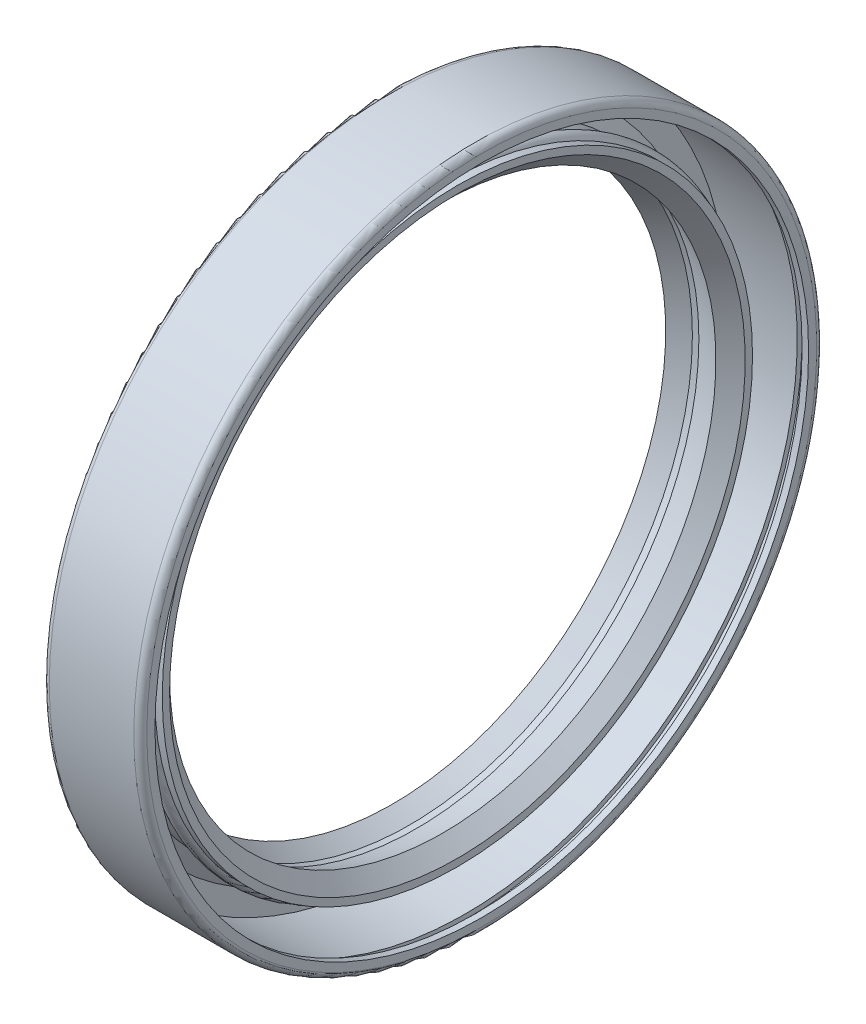
ISO-10303-21;
HEADER;
FILE_DESCRIPTION(('STEP AP214'),'2;1');
FILE_NAME('part.step','',(''),(''),'','','');
FILE_SCHEMA(('AUTOMOTIVE_DESIGN { 1 0 10303 214 1 1 1 1 }'));
ENDSEC;
DATA;
#1=APPLICATION_CONTEXT('core data for automotive mechanical design processes');
#2=APPLICATION_PROTOCOL_DEFINITION('international standard','automotive_design',2000,#1);
#3=PRODUCT_CONTEXT('',#1,'mechanical');
#4=PRODUCT('Part','Part','',(#3));
#5=PRODUCT_RELATED_PRODUCT_CATEGORY('part','',(#4));
#6=PRODUCT_DEFINITION_FORMATION('','',#4);
#7=PRODUCT_DEFINITION_CONTEXT('part definition',#1,'design');
#8=PRODUCT_DEFINITION('design','',#6,#7);
#9=PRODUCT_DEFINITION_SHAPE('','',#8);
#10=(LENGTH_UNIT() NAMED_UNIT(*) SI_UNIT(.MILLI.,.METRE.));
#11=(NAMED_UNIT(*) PLANE_ANGLE_UNIT() SI_UNIT($,.RADIAN.));
#12=(NAMED_UNIT(*) SI_UNIT($,.STERADIAN.) SOLID_ANGLE_UNIT());
#13=UNCERTAINTY_MEASURE_WITH_UNIT(LENGTH_MEASURE(1.E-05),#10,'distance_accuracy_value','');
#14=(GEOMETRIC_REPRESENTATION_CONTEXT(3) GLOBAL_UNCERTAINTY_ASSIGNED_CONTEXT((#13)) GLOBAL_UNIT_ASSIGNED_CONTEXT((#10,
#11,#12)) REPRESENTATION_CONTEXT('',''));
#15=CARTESIAN_POINT('',(0.,0.,0.));
#16=DIRECTION('',(0.,0.,1.));
#17=DIRECTION('',(1.,0.,0.));
#18=AXIS2_PLACEMENT_3D('',#15,#16,#17);
#19=CARTESIAN_POINT('',(0.,0.,0.));
#20=DIRECTION('',(-1.,0.,0.));
#21=DIRECTION('',(0.,0.,1.));
#22=AXIS2_PLACEMENT_3D('',#19,#20,#21);
#23=CONICAL_SURFACE('',#22,15.6830127018922,1.04719755119659);
#24=CARTESIAN_POINT('',(0.250000000000002,0.,0.));
#25=DIRECTION('',(-1.,0.,0.));
#26=DIRECTION('',(0.,0.,1.));
#27=AXIS2_PLACEMENT_3D('',#24,#25,#26);
#28=CIRCLE('',#27,15.25);
#29=CARTESIAN_POINT('',(0.250000000000002,0.,15.25));
#30=VERTEX_POINT('',#29);
#31=EDGE_CURVE('E10',#30,#30,#28,.T.);
#32=ORIENTED_EDGE('',*,*,#31,.F.);
#33=EDGE_LOOP('',(#32));
#34=FACE_BOUND('',#33,.T.);
#35=CARTESIAN_POINT('',(0.,0.,0.));
#36=DIRECTION('',(-1.,0.,0.));
#37=DIRECTION('',(0.,0.,1.));
#38=AXIS2_PLACEMENT_3D('',#35,#36,#37);
#39=CIRCLE('',#38,15.6830127018922);
#40=CARTESIAN_POINT('',(0.,0.,15.6830127018922));
#41=VERTEX_POINT('',#40);
#42=EDGE_CURVE('E114',#41,#41,#39,.T.);
#43=ORIENTED_EDGE('',*,*,#42,.T.);
#44=EDGE_LOOP('',(#43));
#45=FACE_BOUND('',#44,.T.);
#46=ADVANCED_FACE('F29',(#34,#45),#23,.F.);
#47=CARTESIAN_POINT('',(0.,0.,0.));
#48=DIRECTION('',(-1.,0.,0.));
#49=DIRECTION('',(0.,0.,1.));
#50=AXIS2_PLACEMENT_3D('',#47,#48,#49);
#51=CYLINDRICAL_SURFACE('',#50,15.25);
#52=CARTESIAN_POINT('',(0.,0.,0.));
#53=DIRECTION('',(-1.,0.,0.));
#54=DIRECTION('',(0.,0.,1.));
#55=AXIS2_PLACEMENT_3D('',#52,#53,#54);
#56=CIRCLE('',#55,15.25);
#57=CARTESIAN_POINT('',(0.,0.,15.25));
#58=VERTEX_POINT('',#57);
#59=EDGE_CURVE('E35',#58,#58,#56,.T.);
#60=ORIENTED_EDGE('',*,*,#59,.F.);
#61=EDGE_LOOP('',(#60));
#62=FACE_BOUND('',#61,.T.);
#63=ORIENTED_EDGE('',*,*,#31,.T.);
#64=EDGE_LOOP('',(#63));
#65=FACE_BOUND('',#64,.T.);
#66=ADVANCED_FACE('F265',(#62,#65),#51,.T.);
#67=CARTESIAN_POINT('',(0.,0.,-15.25));
#68=DIRECTION('',(1.,0.,0.));
#69=DIRECTION('',(0.,0.,-1.));
#70=AXIS2_PLACEMENT_3D('',#67,#68,#69);
#71=PLANE('',#70);
#72=CARTESIAN_POINT('',(0.,0.,0.));
#73=DIRECTION('',(-1.,0.,0.));
#74=DIRECTION('',(0.,0.,1.));
#75=AXIS2_PLACEMENT_3D('',#72,#73,#74);
#76=CIRCLE('',#75,14.8333333333333);
#77=CARTESIAN_POINT('',(0.,0.,14.8333333333333));
#78=VERTEX_POINT('',#77);
#79=EDGE_CURVE('E39',#78,#78,#76,.T.);
#80=ORIENTED_EDGE('',*,*,#79,.F.);
#81=EDGE_LOOP('',(#80));
#82=FACE_BOUND('',#81,.T.);
#83=ORIENTED_EDGE('',*,*,#59,.T.);
#84=EDGE_LOOP('',(#83));
#85=FACE_BOUND('',#84,.T.);
#86=ADVANCED_FACE('F260',(#82,#85),#71,.F.);
#87=CARTESIAN_POINT('',(0.333333333333335,0.,0.));
#88=DIRECTION('',(-1.,0.,0.));
#89=DIRECTION('',(0.,0.,1.));
#90=AXIS2_PLACEMENT_3D('',#87,#88,#89);
#91=TOROIDAL_SURFACE('',#90,14.8333333333333,0.333333333333333);
#92=CARTESIAN_POINT('',(0.333333333333335,0.,0.));
#93=DIRECTION('',(-1.,0.,0.));
#94=DIRECTION('',(0.,0.,1.));
#95=AXIS2_PLACEMENT_3D('',#92,#93,#94);
#96=CIRCLE('',#95,14.5);
#97=CARTESIAN_POINT('',(0.333333333333335,0.,14.5));
#98=VERTEX_POINT('',#97);
#99=EDGE_CURVE('E43',#98,#98,#96,.T.);
#100=ORIENTED_EDGE('',*,*,#99,.F.);
#101=EDGE_LOOP('',(#100));
#102=FACE_BOUND('',#101,.T.);
#103=ORIENTED_EDGE('',*,*,#79,.T.);
#104=EDGE_LOOP('',(#103));
#105=FACE_BOUND('',#104,.T.);
#106=ADVANCED_FACE('F254',(#102,#105),#91,.T.);
#107=CARTESIAN_POINT('',(0.,0.,0.));
#108=DIRECTION('',(-1.,0.,0.));
#109=DIRECTION('',(0.,0.,1.));
#110=AXIS2_PLACEMENT_3D('',#107,#108,#109);
#111=CYLINDRICAL_SURFACE('',#110,14.5);
#112=CARTESIAN_POINT('',(0.583333333333335,0.,0.));
#113=DIRECTION('',(-1.,0.,0.));
#114=DIRECTION('',(0.,0.,1.));
#115=AXIS2_PLACEMENT_3D('',#112,#113,#114);
#116=CIRCLE('',#115,14.5);
#117=CARTESIAN_POINT('',(0.583333333333335,0.,14.5));
#118=VERTEX_POINT('',#117);
#119=EDGE_CURVE('E48',#118,#118,#116,.T.);
#120=ORIENTED_EDGE('',*,*,#119,.F.);
#121=EDGE_LOOP('',(#120));
#122=FACE_BOUND('',#121,.T.);
#123=ORIENTED_EDGE('',*,*,#99,.T.);
#124=EDGE_LOOP('',(#123));
#125=FACE_BOUND('',#124,.T.);
#126=ADVANCED_FACE('F248',(#122,#125),#111,.F.);
#127=CARTESIAN_POINT('',(0.583333333333335,0.,0.));
#128=DIRECTION('',(1.,0.,0.));
#129=DIRECTION('',(0.,0.,-1.));
#130=AXIS2_PLACEMENT_3D('',#127,#128,#129);
#131=CONICAL_SURFACE('',#130,14.5,0.523598775598295);
#132=CARTESIAN_POINT('',(0.250000000000002,0.,0.));
#133=DIRECTION('',(-1.,0.,0.));
#134=DIRECTION('',(0.,0.,1.));
#135=AXIS2_PLACEMENT_3D('',#132,#133,#134);
#136=CIRCLE('',#135,14.3075499102701);
#137=CARTESIAN_POINT('',(0.250000000000002,0.,14.3075499102701));
#138=VERTEX_POINT('',#137);
#139=EDGE_CURVE('E51',#138,#138,#136,.T.);
#140=ORIENTED_EDGE('',*,*,#139,.F.);
#141=EDGE_LOOP('',(#140));
#142=FACE_BOUND('',#141,.T.);
#143=ORIENTED_EDGE('',*,*,#119,.T.);
#144=EDGE_LOOP('',(#143));
#145=FACE_BOUND('',#144,.T.);
#146=ADVANCED_FACE('F242',(#142,#145),#131,.T.);
#147=CARTESIAN_POINT('',(0.250000000000002,0.,0.));
#148=DIRECTION('',(-1.,0.,0.));
#149=DIRECTION('',(0.,0.,1.));
#150=AXIS2_PLACEMENT_3D('',#147,#148,#149);
#151=CONICAL_SURFACE('',#150,14.3075499102701,1.0471975511966);
#152=CARTESIAN_POINT('',(0.427564023483705,0.,0.));
#153=DIRECTION('',(-1.,0.,0.));
#154=DIRECTION('',(0.,0.,1.));
#155=AXIS2_PLACEMENT_3D('',#152,#153,#154);
#156=CIRCLE('',#155,14.);
#157=CARTESIAN_POINT('',(0.427564023483705,0.,14.));
#158=VERTEX_POINT('',#157);
#159=EDGE_CURVE('E54',#158,#158,#156,.T.);
#160=ORIENTED_EDGE('',*,*,#159,.F.);
#161=EDGE_LOOP('',(#160));
#162=FACE_BOUND('',#161,.T.);
#163=ORIENTED_EDGE('',*,*,#139,.T.);
#164=EDGE_LOOP('',(#163));
#165=FACE_BOUND('',#164,.T.);
#166=ADVANCED_FACE('F236',(#162,#165),#151,.F.);
#167=CARTESIAN_POINT('',(0.427564023483705,0.,0.));
#168=DIRECTION('',(1.,0.,0.));
#169=DIRECTION('',(0.,0.,-1.));
#170=AXIS2_PLACEMENT_3D('',#167,#168,#169);
#171=CONICAL_SURFACE('',#170,14.,0.523598775598299);
#172=CARTESIAN_POINT('',(1.29358942726814,0.,0.));
#173=DIRECTION('',(-1.,0.,0.));
#174=DIRECTION('',(0.,0.,1.));
#175=AXIS2_PLACEMENT_3D('',#172,#173,#174);
#176=CIRCLE('',#175,14.5);
#177=CARTESIAN_POINT('',(1.29358942726814,0.,14.5));
#178=VERTEX_POINT('',#177);
#179=EDGE_CURVE('E57',#178,#178,#176,.T.);
#180=ORIENTED_EDGE('',*,*,#179,.F.);
#181=EDGE_LOOP('',(#180));
#182=FACE_BOUND('',#181,.T.);
#183=ORIENTED_EDGE('',*,*,#159,.T.);
#184=EDGE_LOOP('',(#183));
#185=FACE_BOUND('',#184,.T.);
#186=ADVANCED_FACE('F230',(#182,#185),#171,.F.);
#187=CARTESIAN_POINT('',(0.,0.,0.));
#188=DIRECTION('',(-1.,0.,0.));
#189=DIRECTION('',(0.,0.,1.));
#190=AXIS2_PLACEMENT_3D('',#187,#188,#189);
#191=CYLINDRICAL_SURFACE('',#190,14.5);
#192=CARTESIAN_POINT('',(1.6262612902727,0.,0.));
#193=DIRECTION('',(-1.,0.,0.));
#194=DIRECTION('',(0.,0.,1.));
#195=AXIS2_PLACEMENT_3D('',#192,#193,#194);
#196=CIRCLE('',#195,14.5);
#197=CARTESIAN_POINT('',(1.6262612902727,0.,14.5));
#198=VERTEX_POINT('',#197);
#199=EDGE_CURVE('E60',#198,#198,#196,.T.);
#200=ORIENTED_EDGE('',*,*,#199,.F.);
#201=EDGE_LOOP('',(#200));
#202=FACE_BOUND('',#201,.T.);
#203=ORIENTED_EDGE('',*,*,#179,.T.);
#204=EDGE_LOOP('',(#203));
#205=FACE_BOUND('',#204,.T.);
#206=ADVANCED_FACE('F224',(#202,#205),#191,.F.);
#207=CARTESIAN_POINT('',(1.6262612902727,0.,0.));
#208=DIRECTION('',(-1.,0.,0.));
#209=DIRECTION('',(0.,0.,1.));
#210=AXIS2_PLACEMENT_3D('',#207,#208,#209);
#211=CONICAL_SURFACE('',#210,14.5,0.349065850398867);
#212=CARTESIAN_POINT('',(3.,0.,0.));
#213=DIRECTION('',(-1.,0.,0.));
#214=DIRECTION('',(0.,0.,1.));
#215=AXIS2_PLACEMENT_3D('',#212,#213,#214);
#216=CIRCLE('',#215,14.);
#217=CARTESIAN_POINT('',(3.,0.,14.));
#218=VERTEX_POINT('',#217);
#219=EDGE_CURVE('E63',#218,#218,#216,.T.);
#220=ORIENTED_EDGE('',*,*,#219,.F.);
#221=EDGE_LOOP('',(#220));
#222=FACE_BOUND('',#221,.T.);
#223=ORIENTED_EDGE('',*,*,#199,.T.);
#224=EDGE_LOOP('',(#223));
#225=FACE_BOUND('',#224,.T.);
#226=ADVANCED_FACE('F218',(#222,#225),#211,.F.);
#227=CARTESIAN_POINT('',(3.,0.,0.));
#228=DIRECTION('',(1.,0.,0.));
#229=DIRECTION('',(0.,0.,-1.));
#230=AXIS2_PLACEMENT_3D('',#227,#228,#229);
#231=CONICAL_SURFACE('',#230,14.,0.78539816339745);
#232=CARTESIAN_POINT('',(3.75,0.,0.));
#233=DIRECTION('',(-1.,0.,0.));
#234=DIRECTION('',(0.,0.,1.));
#235=AXIS2_PLACEMENT_3D('',#232,#233,#234);
#236=CIRCLE('',#235,14.75);
#237=CARTESIAN_POINT('',(3.75,0.,14.75));
#238=VERTEX_POINT('',#237);
#239=EDGE_CURVE('E66',#238,#238,#236,.T.);
#240=ORIENTED_EDGE('',*,*,#239,.F.);
#241=EDGE_LOOP('',(#240));
#242=FACE_BOUND('',#241,.T.);
#243=ORIENTED_EDGE('',*,*,#219,.T.);
#244=EDGE_LOOP('',(#243));
#245=FACE_BOUND('',#244,.T.);
#246=ADVANCED_FACE('F212',(#242,#245),#231,.F.);
#247=CARTESIAN_POINT('',(3.75,0.,-14.75));
#248=DIRECTION('',(-1.,0.,0.));
#249=DIRECTION('',(0.,0.,1.));
#250=AXIS2_PLACEMENT_3D('',#247,#248,#249);
#251=PLANE('',#250);
#252=CARTESIAN_POINT('',(3.75,0.,0.));
#253=DIRECTION('',(-1.,0.,0.));
#254=DIRECTION('',(0.,0.,1.));
#255=AXIS2_PLACEMENT_3D('',#252,#253,#254);
#256=CIRCLE('',#255,15.125);
#257=CARTESIAN_POINT('',(3.75,0.,15.125));
#258=VERTEX_POINT('',#257);
#259=EDGE_CURVE('E69',#258,#258,#256,.T.);
#260=ORIENTED_EDGE('',*,*,#259,.F.);
#261=EDGE_LOOP('',(#260));
#262=FACE_BOUND('',#261,.T.);
#263=ORIENTED_EDGE('',*,*,#239,.T.);
#264=EDGE_LOOP('',(#263));
#265=FACE_BOUND('',#264,.T.);
#266=ADVANCED_FACE('F206',(#262,#265),#251,.F.);
#267=CARTESIAN_POINT('',(0.,0.,0.));
#268=DIRECTION('',(-1.,0.,0.));
#269=DIRECTION('',(0.,0.,1.));
#270=AXIS2_PLACEMENT_3D('',#267,#268,#269);
#271=CYLINDRICAL_SURFACE('',#270,15.125);
#272=CARTESIAN_POINT('',(3.35355339059328,0.,0.));
#273=DIRECTION('',(-1.,0.,0.));
#274=DIRECTION('',(0.,0.,1.));
#275=AXIS2_PLACEMENT_3D('',#272,#273,#274);
#276=CIRCLE('',#275,15.125);
#277=CARTESIAN_POINT('',(3.35355339059328,0.,15.125));
#278=VERTEX_POINT('',#277);
#279=EDGE_CURVE('E72',#278,#278,#276,.T.);
#280=ORIENTED_EDGE('',*,*,#279,.F.);
#281=EDGE_LOOP('',(#280));
#282=FACE_BOUND('',#281,.T.);
#283=ORIENTED_EDGE('',*,*,#259,.T.);
#284=EDGE_LOOP('',(#283));
#285=FACE_BOUND('',#284,.T.);
#286=ADVANCED_FACE('F200',(#282,#285),#271,.T.);
#287=CARTESIAN_POINT('',(3.,0.,0.));
#288=DIRECTION('',(-1.,0.,0.));
#289=DIRECTION('',(0.,0.,1.));
#290=AXIS2_PLACEMENT_3D('',#287,#288,#289);
#291=TOROIDAL_SURFACE('',#290,15.,0.375);
#292=CARTESIAN_POINT('',(2.625,0.,0.));
#293=DIRECTION('',(-1.,0.,0.));
#294=DIRECTION('',(0.,0.,1.));
#295=AXIS2_PLACEMENT_3D('',#292,#293,#294);
#296=CIRCLE('',#295,15.);
#297=CARTESIAN_POINT('',(2.625,0.,15.));
#298=VERTEX_POINT('',#297);
#299=EDGE_CURVE('E75',#298,#298,#296,.T.);
#300=ORIENTED_EDGE('',*,*,#299,.F.);
#301=EDGE_LOOP('',(#300));
#302=FACE_BOUND('',#301,.T.);
#303=ORIENTED_EDGE('',*,*,#279,.T.);
#304=EDGE_LOOP('',(#303));
#305=FACE_BOUND('',#304,.T.);
#306=ADVANCED_FACE('F194',(#302,#305),#291,.T.);
#307=CARTESIAN_POINT('',(0.,0.,0.));
#308=DIRECTION('',(-1.,0.,0.));
#309=DIRECTION('',(0.,0.,1.));
#310=AXIS2_PLACEMENT_3D('',#307,#308,#309);
#311=CYLINDRICAL_SURFACE('',#310,15.);
#312=CARTESIAN_POINT('',(0.971687836487038,0.,0.));
#313=DIRECTION('',(-1.,0.,0.));
#314=DIRECTION('',(0.,0.,1.));
#315=AXIS2_PLACEMENT_3D('',#312,#313,#314);
#316=CIRCLE('',#315,15.);
#317=CARTESIAN_POINT('',(0.971687836487038,0.,15.));
#318=VERTEX_POINT('',#317);
#319=EDGE_CURVE('E78',#318,#318,#316,.T.);
#320=ORIENTED_EDGE('',*,*,#319,.F.);
#321=EDGE_LOOP('',(#320));
#322=FACE_BOUND('',#321,.T.);
#323=ORIENTED_EDGE('',*,*,#299,.T.);
#324=EDGE_LOOP('',(#323));
#325=FACE_BOUND('',#324,.T.);
#326=ADVANCED_FACE('F188',(#322,#325),#311,.T.);
#327=CARTESIAN_POINT('',(0.971687836487038,0.,0.));
#328=DIRECTION('',(-1.,0.,0.));
#329=DIRECTION('',(0.,0.,1.));
#330=AXIS2_PLACEMENT_3D('',#327,#328,#329);
#331=CONICAL_SURFACE('',#330,15.,1.04719755119659);
#332=CARTESIAN_POINT('',(0.500000000000003,0.,0.));
#333=DIRECTION('',(-1.,0.,0.));
#334=DIRECTION('',(0.,0.,1.));
#335=AXIS2_PLACEMENT_3D('',#332,#333,#334);
#336=CIRCLE('',#335,15.8169872981078);
#337=CARTESIAN_POINT('',(0.500000000000003,0.,15.8169872981078));
#338=VERTEX_POINT('',#337);
#339=EDGE_CURVE('E81',#338,#338,#336,.T.);
#340=ORIENTED_EDGE('',*,*,#339,.F.);
#341=EDGE_LOOP('',(#340));
#342=FACE_BOUND('',#341,.T.);
#343=ORIENTED_EDGE('',*,*,#319,.T.);
#344=EDGE_LOOP('',(#343));
#345=FACE_BOUND('',#344,.T.);
#346=ADVANCED_FACE('F182',(#342,#345),#331,.T.);
#347=CARTESIAN_POINT('',(0.500000000000003,0.,-17.));
#348=DIRECTION('',(-1.,0.,0.));
#349=DIRECTION('',(0.,0.,1.));
#350=AXIS2_PLACEMENT_3D('',#347,#348,#349);
#351=PLANE('',#350);
#352=CARTESIAN_POINT('',(0.500000000000002,0.,0.));
#353=DIRECTION('',(-1.,0.,0.));
#354=DIRECTION('',(0.,0.,1.));
#355=AXIS2_PLACEMENT_3D('',#352,#353,#354);
#356=CIRCLE('',#355,17.);
#357=CARTESIAN_POINT('',(0.500000000000002,0.,17.));
#358=VERTEX_POINT('',#357);
#359=EDGE_CURVE('E84',#358,#358,#356,.T.);
#360=ORIENTED_EDGE('',*,*,#359,.F.);
#361=EDGE_LOOP('',(#360));
#362=FACE_BOUND('',#361,.T.);
#363=ORIENTED_EDGE('',*,*,#339,.T.);
#364=EDGE_LOOP('',(#363));
#365=FACE_BOUND('',#364,.T.);
#366=ADVANCED_FACE('F176',(#362,#365),#351,.F.);
#367=CARTESIAN_POINT('',(0.,0.,0.));
#368=DIRECTION('',(-1.,0.,0.));
#369=DIRECTION('',(0.,0.,1.));
#370=AXIS2_PLACEMENT_3D('',#367,#368,#369);
#371=CYLINDRICAL_SURFACE('',#370,17.);
#372=CARTESIAN_POINT('',(4.16666666666667,0.,0.));
#373=DIRECTION('',(-1.,0.,0.));
#374=DIRECTION('',(0.,0.,1.));
#375=AXIS2_PLACEMENT_3D('',#372,#373,#374);
#376=CIRCLE('',#375,17.);
#377=CARTESIAN_POINT('',(4.16666666666667,0.,17.));
#378=VERTEX_POINT('',#377);
#379=EDGE_CURVE('E87',#378,#378,#376,.T.);
#380=ORIENTED_EDGE('',*,*,#379,.F.);
#381=EDGE_LOOP('',(#380));
#382=FACE_BOUND('',#381,.T.);
#383=ORIENTED_EDGE('',*,*,#359,.T.);
#384=EDGE_LOOP('',(#383));
#385=FACE_BOUND('',#384,.T.);
#386=ADVANCED_FACE('F170',(#382,#385),#371,.F.);
#387=CARTESIAN_POINT('',(4.16666666666667,0.,-17.));
#388=DIRECTION('',(-1.,0.,0.));
#389=DIRECTION('',(0.,0.,1.));
#390=AXIS2_PLACEMENT_3D('',#387,#388,#389);
#391=PLANE('',#390);
#392=CARTESIAN_POINT('',(4.16666666666667,0.,0.));
#393=DIRECTION('',(-1.,0.,0.));
#394=DIRECTION('',(0.,0.,1.));
#395=AXIS2_PLACEMENT_3D('',#392,#393,#394);
#396=CIRCLE('',#395,17.25);
#397=CARTESIAN_POINT('',(4.16666666666667,0.,17.25));
#398=VERTEX_POINT('',#397);
#399=EDGE_CURVE('E90',#398,#398,#396,.T.);
#400=ORIENTED_EDGE('',*,*,#399,.F.);
#401=EDGE_LOOP('',(#400));
#402=FACE_BOUND('',#401,.T.);
#403=ORIENTED_EDGE('',*,*,#379,.T.);
#404=EDGE_LOOP('',(#403));
#405=FACE_BOUND('',#404,.T.);
#406=ADVANCED_FACE('F164',(#402,#405),#391,.F.);
#407=CARTESIAN_POINT('',(0.,0.,0.));
#408=DIRECTION('',(-1.,0.,0.));
#409=DIRECTION('',(0.,0.,1.));
#410=AXIS2_PLACEMENT_3D('',#407,#408,#409);
#411=CYLINDRICAL_SURFACE('',#410,17.25);
#412=CARTESIAN_POINT('',(4.66666666666667,0.,0.));
#413=DIRECTION('',(-1.,0.,0.));
#414=DIRECTION('',(0.,0.,1.));
#415=AXIS2_PLACEMENT_3D('',#412,#413,#414);
#416=CIRCLE('',#415,17.25);
#417=CARTESIAN_POINT('',(4.66666666666667,0.,17.25));
#418=VERTEX_POINT('',#417);
#419=EDGE_CURVE('E93',#418,#418,#416,.T.);
#420=ORIENTED_EDGE('',*,*,#419,.F.);
#421=EDGE_LOOP('',(#420));
#422=FACE_BOUND('',#421,.T.);
#423=ORIENTED_EDGE('',*,*,#399,.T.);
#424=EDGE_LOOP('',(#423));
#425=FACE_BOUND('',#424,.T.);
#426=ADVANCED_FACE('F158',(#422,#425),#411,.F.);
#427=CARTESIAN_POINT('',(4.66666666666667,0.,-17.25));
#428=DIRECTION('',(1.,0.,0.));
#429=DIRECTION('',(0.,0.,-1.));
#430=AXIS2_PLACEMENT_3D('',#427,#428,#429);
#431=PLANE('',#430);
#432=CARTESIAN_POINT('',(4.66666666666667,0.,0.));
#433=DIRECTION('',(-1.,0.,0.));
#434=DIRECTION('',(0.,0.,1.));
#435=AXIS2_PLACEMENT_3D('',#432,#433,#434);
#436=CIRCLE('',#435,16.75);
#437=CARTESIAN_POINT('',(4.66666666666667,0.,16.75));
#438=VERTEX_POINT('',#437);
#439=EDGE_CURVE('E96',#438,#438,#436,.T.);
#440=ORIENTED_EDGE('',*,*,#439,.F.);
#441=EDGE_LOOP('',(#440));
#442=FACE_BOUND('',#441,.T.);
#443=ORIENTED_EDGE('',*,*,#419,.T.);
#444=EDGE_LOOP('',(#443));
#445=FACE_BOUND('',#444,.T.);
#446=ADVANCED_FACE('F152',(#442,#445),#431,.F.);
#447=CARTESIAN_POINT('',(0.,0.,0.));
#448=DIRECTION('',(-1.,0.,0.));
#449=DIRECTION('',(0.,0.,1.));
#450=AXIS2_PLACEMENT_3D('',#447,#448,#449);
#451=CYLINDRICAL_SURFACE('',#450,16.75);
#452=CARTESIAN_POINT('',(5.,0.,0.));
#453=DIRECTION('',(-1.,0.,0.));
#454=DIRECTION('',(0.,0.,1.));
#455=AXIS2_PLACEMENT_3D('',#452,#453,#454);
#456=CIRCLE('',#455,16.75);
#457=CARTESIAN_POINT('',(5.,0.,16.75));
#458=VERTEX_POINT('',#457);
#459=EDGE_CURVE('E99',#458,#458,#456,.T.);
#460=ORIENTED_EDGE('',*,*,#459,.F.);
#461=EDGE_LOOP('',(#460));
#462=FACE_BOUND('',#461,.T.);
#463=ORIENTED_EDGE('',*,*,#439,.T.);
#464=EDGE_LOOP('',(#463));
#465=FACE_BOUND('',#464,.T.);
#466=ADVANCED_FACE('F146',(#462,#465),#451,.F.);
#467=CARTESIAN_POINT('',(5.,0.,-16.75));
#468=DIRECTION('',(-1.,0.,0.));
#469=DIRECTION('',(0.,0.,1.));
#470=AXIS2_PLACEMENT_3D('',#467,#468,#469);
#471=PLANE('',#470);
#472=CARTESIAN_POINT('',(5.,0.,0.));
#473=DIRECTION('',(-1.,0.,0.));
#474=DIRECTION('',(0.,0.,1.));
#475=AXIS2_PLACEMENT_3D('',#472,#473,#474);
#476=CIRCLE('',#475,17.1666666666667);
#477=CARTESIAN_POINT('',(5.,0.,17.1666666666667));
#478=VERTEX_POINT('',#477);
#479=EDGE_CURVE('E102',#478,#478,#476,.T.);
#480=ORIENTED_EDGE('',*,*,#479,.F.);
#481=EDGE_LOOP('',(#480));
#482=FACE_BOUND('',#481,.T.);
#483=ORIENTED_EDGE('',*,*,#459,.T.);
#484=EDGE_LOOP('',(#483));
#485=FACE_BOUND('',#484,.T.);
#486=ADVANCED_FACE('F140',(#482,#485),#471,.F.);
#487=CARTESIAN_POINT('',(4.66666666666667,0.,0.));
#488=DIRECTION('',(-1.,0.,0.));
#489=DIRECTION('',(0.,0.,1.));
#490=AXIS2_PLACEMENT_3D('',#487,#488,#489);
#491=TOROIDAL_SURFACE('',#490,17.1666666666667,0.333333333333334);
#492=CARTESIAN_POINT('',(4.66666666666667,0.,0.));
#493=DIRECTION('',(-1.,0.,0.));
#494=DIRECTION('',(0.,0.,1.));
#495=AXIS2_PLACEMENT_3D('',#492,#493,#494);
#496=CIRCLE('',#495,17.5);
#497=CARTESIAN_POINT('',(4.66666666666667,0.,17.5));
#498=VERTEX_POINT('',#497);
#499=EDGE_CURVE('E105',#498,#498,#496,.T.);
#500=ORIENTED_EDGE('',*,*,#499,.F.);
#501=EDGE_LOOP('',(#500));
#502=FACE_BOUND('',#501,.T.);
#503=ORIENTED_EDGE('',*,*,#479,.T.);
#504=EDGE_LOOP('',(#503));
#505=FACE_BOUND('',#504,.T.);
#506=ADVANCED_FACE('F134',(#502,#505),#491,.T.);
#507=CARTESIAN_POINT('',(0.,0.,0.));
#508=DIRECTION('',(-1.,0.,0.));
#509=DIRECTION('',(0.,0.,1.));
#510=AXIS2_PLACEMENT_3D('',#507,#508,#509);
#511=CYLINDRICAL_SURFACE('',#510,17.5);
#512=CARTESIAN_POINT('',(0.333333333333333,0.,0.));
#513=DIRECTION('',(-1.,0.,0.));
#514=DIRECTION('',(0.,0.,1.));
#515=AXIS2_PLACEMENT_3D('',#512,#513,#514);
#516=CIRCLE('',#515,17.5);
#517=CARTESIAN_POINT('',(0.333333333333333,0.,17.5));
#518=VERTEX_POINT('',#517);
#519=EDGE_CURVE('E108',#518,#518,#516,.T.);
#520=ORIENTED_EDGE('',*,*,#519,.F.);
#521=EDGE_LOOP('',(#520));
#522=FACE_BOUND('',#521,.T.);
#523=ORIENTED_EDGE('',*,*,#499,.T.);
#524=EDGE_LOOP('',(#523));
#525=FACE_BOUND('',#524,.T.);
#526=ADVANCED_FACE('F128',(#522,#525),#511,.T.);
#527=CARTESIAN_POINT('',(0.333333333333333,0.,0.));
#528=DIRECTION('',(-1.,0.,0.));
#529=DIRECTION('',(0.,0.,1.));
#530=AXIS2_PLACEMENT_3D('',#527,#528,#529);
#531=TOROIDAL_SURFACE('',#530,17.1666666666667,0.333333333333334);
#532=CARTESIAN_POINT('',(0.,0.,0.));
#533=DIRECTION('',(-1.,0.,0.));
#534=DIRECTION('',(0.,0.,1.));
#535=AXIS2_PLACEMENT_3D('',#532,#533,#534);
#536=CIRCLE('',#535,17.1666666666667);
#537=CARTESIAN_POINT('',(0.,0.,17.1666666666667));
#538=VERTEX_POINT('',#537);
#539=EDGE_CURVE('E111',#538,#538,#536,.T.);
#540=ORIENTED_EDGE('',*,*,#539,.F.);
#541=EDGE_LOOP('',(#540));
#542=FACE_BOUND('',#541,.T.);
#543=ORIENTED_EDGE('',*,*,#519,.T.);
#544=EDGE_LOOP('',(#543));
#545=FACE_BOUND('',#544,.T.);
#546=ADVANCED_FACE('F122',(#542,#545),#531,.T.);
#547=CARTESIAN_POINT('',(0.,0.,-15.6830127018922));
#548=DIRECTION('',(1.,0.,0.));
#549=DIRECTION('',(0.,0.,-1.));
#550=AXIS2_PLACEMENT_3D('',#547,#548,#549);
#551=PLANE('',#550);
#552=ORIENTED_EDGE('',*,*,#42,.F.);
#553=EDGE_LOOP('',(#552));
#554=FACE_BOUND('',#553,.T.);
#555=ORIENTED_EDGE('',*,*,#539,.T.);
#556=EDGE_LOOP('',(#555));
#557=FACE_BOUND('',#556,.T.);
#558=ADVANCED_FACE('F119',(#554,#557),#551,.F.);
#559=CLOSED_SHELL('',(#46,#66,#86,#106,#126,#146,#166,#186,#206,#226,#246,#266,#286,#306,#326,
#346,#366,#386,#406,#426,#446,#466,#486,#506,#526,#546,#558));
#560=MANIFOLD_SOLID_BREP('B2',#559);
#561=ADVANCED_BREP_SHAPE_REPRESENTATION('',(#18,#560),#14);
#562=SHAPE_DEFINITION_REPRESENTATION(#9,#561);
ENDSEC;
END-ISO-10303-21;
